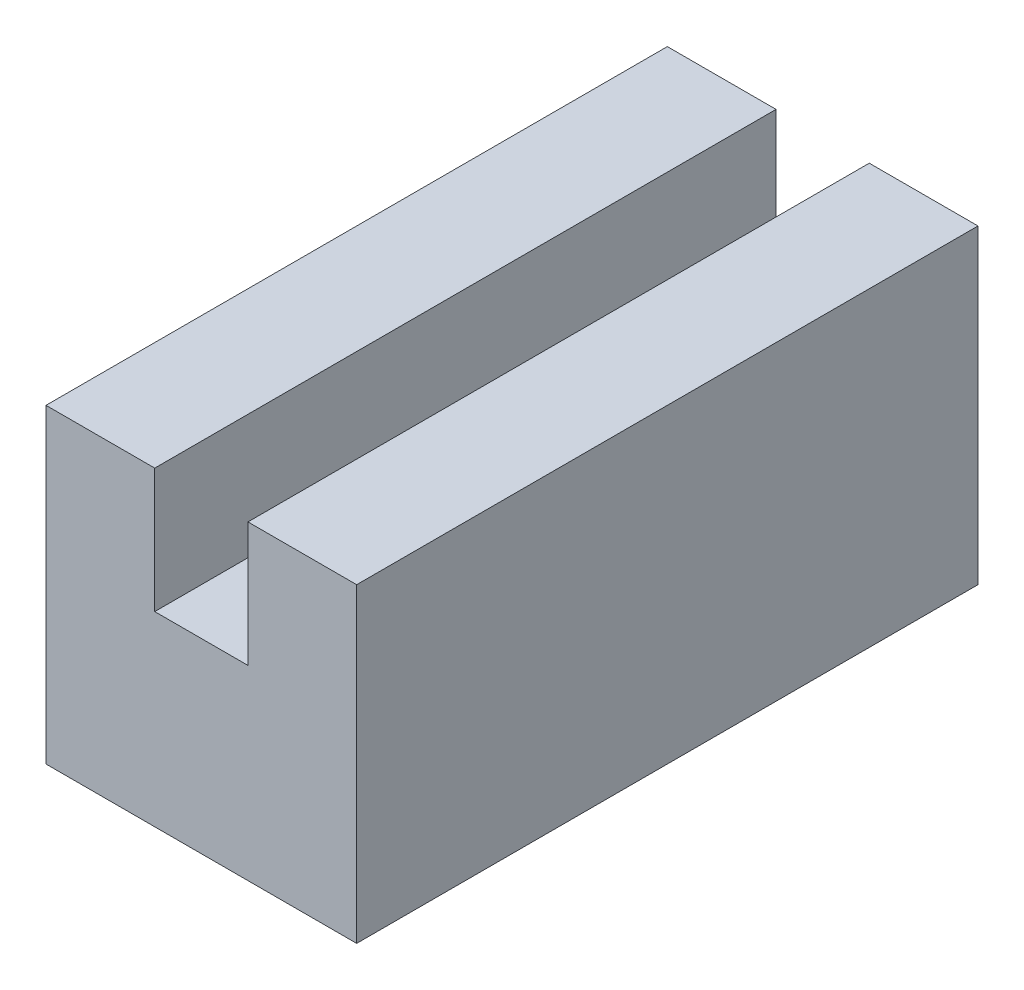
ISO-10303-21;
HEADER;
FILE_DESCRIPTION(('STEP AP214'),'2;1');
FILE_NAME('part.step','',(''),(''),'','','');
FILE_SCHEMA(('AUTOMOTIVE_DESIGN { 1 0 10303 214 1 1 1 1 }'));
ENDSEC;
DATA;
#1=APPLICATION_CONTEXT('core data for automotive mechanical design processes');
#2=APPLICATION_PROTOCOL_DEFINITION('international standard','automotive_design',2000,#1);
#3=PRODUCT_CONTEXT('',#1,'mechanical');
#4=PRODUCT('Part','Part','',(#3));
#5=PRODUCT_RELATED_PRODUCT_CATEGORY('part','',(#4));
#6=PRODUCT_DEFINITION_FORMATION('','',#4);
#7=PRODUCT_DEFINITION_CONTEXT('part definition',#1,'design');
#8=PRODUCT_DEFINITION('design','',#6,#7);
#9=PRODUCT_DEFINITION_SHAPE('','',#8);
#10=(LENGTH_UNIT() NAMED_UNIT(*) SI_UNIT(.MILLI.,.METRE.));
#11=(NAMED_UNIT(*) PLANE_ANGLE_UNIT() SI_UNIT($,.RADIAN.));
#12=(NAMED_UNIT(*) SI_UNIT($,.STERADIAN.) SOLID_ANGLE_UNIT());
#13=UNCERTAINTY_MEASURE_WITH_UNIT(LENGTH_MEASURE(1.E-05),#10,'distance_accuracy_value','');
#14=(GEOMETRIC_REPRESENTATION_CONTEXT(3) GLOBAL_UNCERTAINTY_ASSIGNED_CONTEXT((#13)) GLOBAL_UNIT_ASSIGNED_CONTEXT((#10,
#11,#12)) REPRESENTATION_CONTEXT('',''));
#15=CARTESIAN_POINT('',(0.,0.,0.));
#16=DIRECTION('',(0.,0.,1.));
#17=DIRECTION('',(1.,0.,0.));
#18=AXIS2_PLACEMENT_3D('',#15,#16,#17);
#19=CARTESIAN_POINT('',(0.,5.,10.));
#20=DIRECTION('',(0.,-1.,0.));
#21=DIRECTION('',(0.,0.,-1.));
#22=AXIS2_PLACEMENT_3D('',#19,#20,#21);
#23=PLANE('',#22);
#24=DIRECTION('',(-1.,0.,0.));
#25=VECTOR('',#24,1.);
#26=CARTESIAN_POINT('',(0.,5.,10.));
#27=LINE('',#26,#25);
#28=CARTESIAN_POINT('',(1.75,5.,10.));
#29=VERTEX_POINT('',#28);
#30=CARTESIAN_POINT('',(0.,5.,10.));
#31=VERTEX_POINT('',#30);
#32=EDGE_CURVE('E56',#29,#31,#27,.T.);
#33=ORIENTED_EDGE('',*,*,#32,.F.);
#34=DIRECTION('',(0.,0.,1.));
#35=VECTOR('',#34,1.);
#36=CARTESIAN_POINT('',(1.75,5.,0.));
#37=LINE('',#36,#35);
#38=CARTESIAN_POINT('',(1.75,5.,0.));
#39=VERTEX_POINT('',#38);
#40=EDGE_CURVE('E110',#39,#29,#37,.T.);
#41=ORIENTED_EDGE('',*,*,#40,.F.);
#42=DIRECTION('',(-1.,0.,0.));
#43=VECTOR('',#42,1.);
#44=CARTESIAN_POINT('',(0.,5.,0.));
#45=LINE('',#44,#43);
#46=CARTESIAN_POINT('',(0.,5.,0.));
#47=VERTEX_POINT('',#46);
#48=EDGE_CURVE('E78',#39,#47,#45,.T.);
#49=ORIENTED_EDGE('',*,*,#48,.T.);
#50=DIRECTION('',(0.,0.,-1.));
#51=VECTOR('',#50,1.);
#52=CARTESIAN_POINT('',(0.,5.,10.));
#53=LINE('',#52,#51);
#54=EDGE_CURVE('E145',#31,#47,#53,.T.);
#55=ORIENTED_EDGE('',*,*,#54,.F.);
#56=EDGE_LOOP('',(#33,#41,#49,#55));
#57=FACE_BOUND('',#56,.T.);
#58=ADVANCED_FACE('F32',(#57),#23,.F.);
#59=CARTESIAN_POINT('',(0.,0.,10.));
#60=DIRECTION('',(1.,0.,0.));
#61=DIRECTION('',(0.,0.,-1.));
#62=AXIS2_PLACEMENT_3D('',#59,#60,#61);
#63=PLANE('',#62);
#64=DIRECTION('',(0.,-1.,0.));
#65=VECTOR('',#64,1.);
#66=CARTESIAN_POINT('',(0.,0.,0.));
#67=LINE('',#66,#65);
#68=CARTESIAN_POINT('',(0.,0.,0.));
#69=VERTEX_POINT('',#68);
#70=EDGE_CURVE('E132',#47,#69,#67,.T.);
#71=ORIENTED_EDGE('',*,*,#70,.T.);
#72=DIRECTION('',(0.,0.,-1.));
#73=VECTOR('',#72,1.);
#74=CARTESIAN_POINT('',(0.,0.,10.));
#75=LINE('',#74,#73);
#76=CARTESIAN_POINT('',(0.,0.,10.));
#77=VERTEX_POINT('',#76);
#78=EDGE_CURVE('E11',#77,#69,#75,.T.);
#79=ORIENTED_EDGE('',*,*,#78,.F.);
#80=DIRECTION('',(0.,-1.,0.));
#81=VECTOR('',#80,1.);
#82=CARTESIAN_POINT('',(0.,0.,10.));
#83=LINE('',#82,#81);
#84=EDGE_CURVE('E137',#31,#77,#83,.T.);
#85=ORIENTED_EDGE('',*,*,#84,.F.);
#86=ORIENTED_EDGE('',*,*,#54,.T.);
#87=EDGE_LOOP('',(#71,#79,#85,#86));
#88=FACE_BOUND('',#87,.T.);
#89=ADVANCED_FACE('F34',(#88),#63,.F.);
#90=CARTESIAN_POINT('',(0.,0.,10.));
#91=DIRECTION('',(0.,1.,0.));
#92=DIRECTION('',(0.,0.,1.));
#93=AXIS2_PLACEMENT_3D('',#90,#91,#92);
#94=PLANE('',#93);
#95=DIRECTION('',(1.,0.,0.));
#96=VECTOR('',#95,1.);
#97=CARTESIAN_POINT('',(0.,0.,0.));
#98=LINE('',#97,#96);
#99=CARTESIAN_POINT('',(5.,0.,0.));
#100=VERTEX_POINT('',#99);
#101=EDGE_CURVE('E148',#69,#100,#98,.T.);
#102=ORIENTED_EDGE('',*,*,#101,.T.);
#103=DIRECTION('',(0.,0.,-1.));
#104=VECTOR('',#103,1.);
#105=CARTESIAN_POINT('',(5.,0.,10.));
#106=LINE('',#105,#104);
#107=CARTESIAN_POINT('',(5.,0.,10.));
#108=VERTEX_POINT('',#107);
#109=EDGE_CURVE('E40',#108,#100,#106,.T.);
#110=ORIENTED_EDGE('',*,*,#109,.F.);
#111=DIRECTION('',(1.,0.,0.));
#112=VECTOR('',#111,1.);
#113=CARTESIAN_POINT('',(0.,0.,10.));
#114=LINE('',#113,#112);
#115=EDGE_CURVE('E85',#77,#108,#114,.T.);
#116=ORIENTED_EDGE('',*,*,#115,.F.);
#117=ORIENTED_EDGE('',*,*,#78,.T.);
#118=EDGE_LOOP('',(#102,#110,#116,#117));
#119=FACE_BOUND('',#118,.T.);
#120=ADVANCED_FACE('F174',(#119),#94,.F.);
#121=CARTESIAN_POINT('',(5.,0.,10.));
#122=DIRECTION('',(-1.,0.,0.));
#123=DIRECTION('',(0.,0.,1.));
#124=AXIS2_PLACEMENT_3D('',#121,#122,#123);
#125=PLANE('',#124);
#126=DIRECTION('',(0.,1.,0.));
#127=VECTOR('',#126,1.);
#128=CARTESIAN_POINT('',(5.,0.,0.));
#129=LINE('',#128,#127);
#130=CARTESIAN_POINT('',(5.,5.,0.));
#131=VERTEX_POINT('',#130);
#132=EDGE_CURVE('E150',#100,#131,#129,.T.);
#133=ORIENTED_EDGE('',*,*,#132,.T.);
#134=DIRECTION('',(0.,0.,-1.));
#135=VECTOR('',#134,1.);
#136=CARTESIAN_POINT('',(5.,5.,10.));
#137=LINE('',#136,#135);
#138=CARTESIAN_POINT('',(5.,5.,10.));
#139=VERTEX_POINT('',#138);
#140=EDGE_CURVE('E155',#139,#131,#137,.T.);
#141=ORIENTED_EDGE('',*,*,#140,.F.);
#142=DIRECTION('',(0.,1.,0.));
#143=VECTOR('',#142,1.);
#144=CARTESIAN_POINT('',(5.,0.,10.));
#145=LINE('',#144,#143);
#146=EDGE_CURVE('E141',#108,#139,#145,.T.);
#147=ORIENTED_EDGE('',*,*,#146,.F.);
#148=ORIENTED_EDGE('',*,*,#109,.T.);
#149=EDGE_LOOP('',(#133,#141,#147,#148));
#150=FACE_BOUND('',#149,.T.);
#151=ADVANCED_FACE('F161',(#150),#125,.F.);
#152=CARTESIAN_POINT('',(3.25,5.,0.));
#153=VERTEX_POINT('',#152);
#154=EDGE_CURVE('E139',#131,#153,#45,.T.);
#155=ORIENTED_EDGE('',*,*,#154,.T.);
#156=DIRECTION('',(0.,0.,-1.));
#157=VECTOR('',#156,1.);
#158=CARTESIAN_POINT('',(3.25,5.,0.));
#159=LINE('',#158,#157);
#160=CARTESIAN_POINT('',(3.25,5.,10.));
#161=VERTEX_POINT('',#160);
#162=EDGE_CURVE('E120',#161,#153,#159,.T.);
#163=ORIENTED_EDGE('',*,*,#162,.F.);
#164=EDGE_CURVE('E143',#139,#161,#27,.T.);
#165=ORIENTED_EDGE('',*,*,#164,.F.);
#166=ORIENTED_EDGE('',*,*,#140,.T.);
#167=EDGE_LOOP('',(#155,#163,#165,#166));
#168=FACE_BOUND('',#167,.T.);
#169=ADVANCED_FACE('F169',(#168),#23,.F.);
#170=CARTESIAN_POINT('',(0.,0.,10.));
#171=DIRECTION('',(0.,0.,-1.));
#172=DIRECTION('',(-1.,0.,0.));
#173=AXIS2_PLACEMENT_3D('',#170,#171,#172);
#174=PLANE('',#173);
#175=DIRECTION('',(1.,0.,0.));
#176=VECTOR('',#175,1.);
#177=CARTESIAN_POINT('',(1.75,3.,10.));
#178=LINE('',#177,#176);
#179=CARTESIAN_POINT('',(1.75,3.,10.));
#180=VERTEX_POINT('',#179);
#181=CARTESIAN_POINT('',(3.25,3.,10.));
#182=VERTEX_POINT('',#181);
#183=EDGE_CURVE('E116',#180,#182,#178,.T.);
#184=ORIENTED_EDGE('',*,*,#183,.F.);
#185=DIRECTION('',(0.,1.,0.));
#186=VECTOR('',#185,1.);
#187=CARTESIAN_POINT('',(1.75,3.,10.));
#188=LINE('',#187,#186);
#189=EDGE_CURVE('E106',#180,#29,#188,.T.);
#190=ORIENTED_EDGE('',*,*,#189,.T.);
#191=ORIENTED_EDGE('',*,*,#32,.T.);
#192=ORIENTED_EDGE('',*,*,#84,.T.);
#193=ORIENTED_EDGE('',*,*,#115,.T.);
#194=ORIENTED_EDGE('',*,*,#146,.T.);
#195=ORIENTED_EDGE('',*,*,#164,.T.);
#196=DIRECTION('',(0.,1.,0.));
#197=VECTOR('',#196,1.);
#198=CARTESIAN_POINT('',(3.25,3.,10.));
#199=LINE('',#198,#197);
#200=EDGE_CURVE('E112',#182,#161,#199,.T.);
#201=ORIENTED_EDGE('',*,*,#200,.F.);
#202=EDGE_LOOP('',(#184,#190,#191,#192,#193,#194,#195,#201));
#203=FACE_BOUND('',#202,.T.);
#204=ADVANCED_FACE('F122',(#203),#174,.F.);
#205=CARTESIAN_POINT('',(0.,0.,0.));
#206=DIRECTION('',(0.,0.,-1.));
#207=DIRECTION('',(-1.,0.,0.));
#208=AXIS2_PLACEMENT_3D('',#205,#206,#207);
#209=PLANE('',#208);
#210=DIRECTION('',(0.,1.,0.));
#211=VECTOR('',#210,1.);
#212=CARTESIAN_POINT('',(1.75,3.,0.));
#213=LINE('',#212,#211);
#214=CARTESIAN_POINT('',(1.75,3.,0.));
#215=VERTEX_POINT('',#214);
#216=EDGE_CURVE('E130',#215,#39,#213,.T.);
#217=ORIENTED_EDGE('',*,*,#216,.F.);
#218=DIRECTION('',(-1.,0.,0.));
#219=VECTOR('',#218,1.);
#220=CARTESIAN_POINT('',(1.75,3.,0.));
#221=LINE('',#220,#219);
#222=CARTESIAN_POINT('',(3.25,3.,0.));
#223=VERTEX_POINT('',#222);
#224=EDGE_CURVE('E113',#223,#215,#221,.T.);
#225=ORIENTED_EDGE('',*,*,#224,.F.);
#226=DIRECTION('',(0.,1.,0.));
#227=VECTOR('',#226,1.);
#228=CARTESIAN_POINT('',(3.25,3.,0.));
#229=LINE('',#228,#227);
#230=EDGE_CURVE('E133',#223,#153,#229,.T.);
#231=ORIENTED_EDGE('',*,*,#230,.T.);
#232=ORIENTED_EDGE('',*,*,#154,.F.);
#233=ORIENTED_EDGE('',*,*,#132,.F.);
#234=ORIENTED_EDGE('',*,*,#101,.F.);
#235=ORIENTED_EDGE('',*,*,#70,.F.);
#236=ORIENTED_EDGE('',*,*,#48,.F.);
#237=EDGE_LOOP('',(#217,#225,#231,#232,#233,#234,#235,#236));
#238=FACE_BOUND('',#237,.T.);
#239=ADVANCED_FACE('F165',(#238),#209,.T.);
#240=CARTESIAN_POINT('',(1.75,3.,0.));
#241=DIRECTION('',(-1.,0.,0.));
#242=DIRECTION('',(0.,0.,1.));
#243=AXIS2_PLACEMENT_3D('',#240,#241,#242);
#244=PLANE('',#243);
#245=ORIENTED_EDGE('',*,*,#40,.T.);
#246=ORIENTED_EDGE('',*,*,#189,.F.);
#247=DIRECTION('',(0.,0.,1.));
#248=VECTOR('',#247,1.);
#249=CARTESIAN_POINT('',(1.75,3.,0.));
#250=LINE('',#249,#248);
#251=EDGE_CURVE('E109',#215,#180,#250,.T.);
#252=ORIENTED_EDGE('',*,*,#251,.F.);
#253=ORIENTED_EDGE('',*,*,#216,.T.);
#254=EDGE_LOOP('',(#245,#246,#252,#253));
#255=FACE_BOUND('',#254,.T.);
#256=ADVANCED_FACE('F108',(#255),#244,.F.);
#257=CARTESIAN_POINT('',(3.25,3.,0.));
#258=DIRECTION('',(1.,0.,0.));
#259=DIRECTION('',(0.,0.,-1.));
#260=AXIS2_PLACEMENT_3D('',#257,#258,#259);
#261=PLANE('',#260);
#262=ORIENTED_EDGE('',*,*,#162,.T.);
#263=ORIENTED_EDGE('',*,*,#230,.F.);
#264=DIRECTION('',(0.,0.,-1.));
#265=VECTOR('',#264,1.);
#266=CARTESIAN_POINT('',(3.25,3.,0.));
#267=LINE('',#266,#265);
#268=EDGE_CURVE('E47',#182,#223,#267,.T.);
#269=ORIENTED_EDGE('',*,*,#268,.F.);
#270=ORIENTED_EDGE('',*,*,#200,.T.);
#271=EDGE_LOOP('',(#262,#263,#269,#270));
#272=FACE_BOUND('',#271,.T.);
#273=ADVANCED_FACE('F197',(#272),#261,.F.);
#274=CARTESIAN_POINT('',(0.,3.,0.));
#275=DIRECTION('',(0.,1.,0.));
#276=DIRECTION('',(0.,0.,1.));
#277=AXIS2_PLACEMENT_3D('',#274,#275,#276);
#278=PLANE('',#277);
#279=ORIENTED_EDGE('',*,*,#251,.T.);
#280=ORIENTED_EDGE('',*,*,#183,.T.);
#281=ORIENTED_EDGE('',*,*,#268,.T.);
#282=ORIENTED_EDGE('',*,*,#224,.T.);
#283=EDGE_LOOP('',(#279,#280,#281,#282));
#284=FACE_BOUND('',#283,.T.);
#285=ADVANCED_FACE('F115',(#284),#278,.T.);
#286=CLOSED_SHELL('',(#58,#89,#120,#151,#169,#204,#239,#256,#273,#285));
#287=MANIFOLD_SOLID_BREP('B2',#286);
#288=ADVANCED_BREP_SHAPE_REPRESENTATION('',(#18,#287),#14);
#289=SHAPE_DEFINITION_REPRESENTATION(#9,#288);
ENDSEC;
END-ISO-10303-21;
